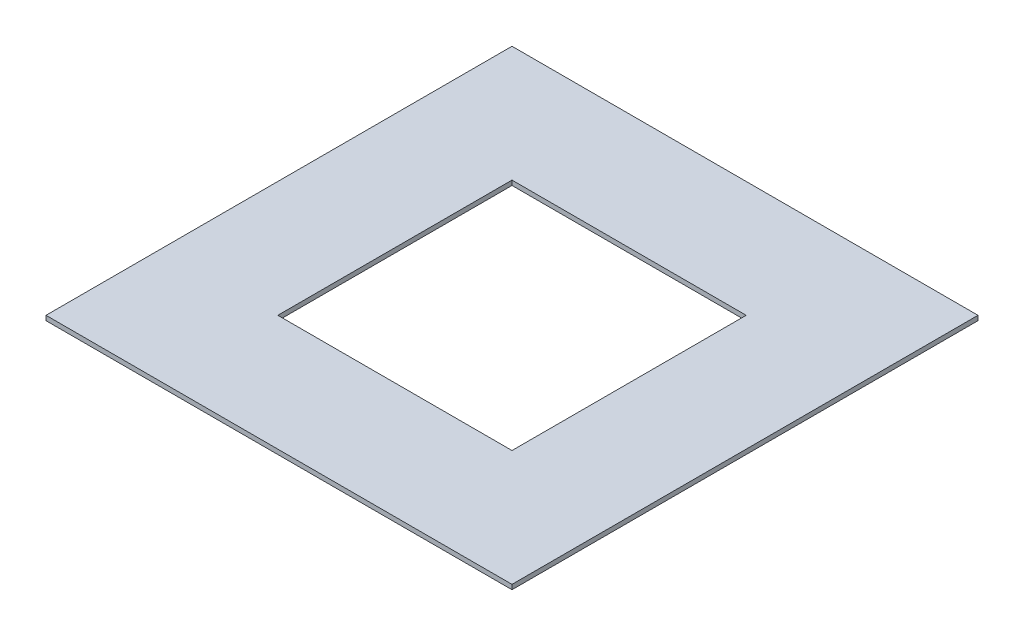
ISO-10303-21;
HEADER;
FILE_DESCRIPTION(('STEP AP214'),'2;1');
FILE_NAME('part.step','',(''),(''),'','','');
FILE_SCHEMA(('AUTOMOTIVE_DESIGN { 1 0 10303 214 1 1 1 1 }'));
ENDSEC;
DATA;
#1=APPLICATION_CONTEXT('core data for automotive mechanical design processes');
#2=APPLICATION_PROTOCOL_DEFINITION('international standard','automotive_design',2000,#1);
#3=PRODUCT_CONTEXT('',#1,'mechanical');
#4=PRODUCT('Part','Part','',(#3));
#5=PRODUCT_RELATED_PRODUCT_CATEGORY('part','',(#4));
#6=PRODUCT_DEFINITION_FORMATION('','',#4);
#7=PRODUCT_DEFINITION_CONTEXT('part definition',#1,'design');
#8=PRODUCT_DEFINITION('design','',#6,#7);
#9=PRODUCT_DEFINITION_SHAPE('','',#8);
#10=(LENGTH_UNIT() NAMED_UNIT(*) SI_UNIT(.MILLI.,.METRE.));
#11=(NAMED_UNIT(*) PLANE_ANGLE_UNIT() SI_UNIT($,.RADIAN.));
#12=(NAMED_UNIT(*) SI_UNIT($,.STERADIAN.) SOLID_ANGLE_UNIT());
#13=UNCERTAINTY_MEASURE_WITH_UNIT(LENGTH_MEASURE(1.E-05),#10,'distance_accuracy_value','');
#14=(GEOMETRIC_REPRESENTATION_CONTEXT(3) GLOBAL_UNCERTAINTY_ASSIGNED_CONTEXT((#13)) GLOBAL_UNIT_ASSIGNED_CONTEXT((#10,
#11,#12)) REPRESENTATION_CONTEXT('',''));
#15=CARTESIAN_POINT('',(0.,0.,0.));
#16=DIRECTION('',(0.,0.,1.));
#17=DIRECTION('',(1.,0.,0.));
#18=AXIS2_PLACEMENT_3D('',#15,#16,#17);
#19=CARTESIAN_POINT('',(0.,1.,0.));
#20=DIRECTION('',(0.,1.,0.));
#21=DIRECTION('',(0.,0.,1.));
#22=AXIS2_PLACEMENT_3D('',#19,#20,#21);
#23=PLANE('',#22);
#24=DIRECTION('',(0.,0.,-1.));
#25=VECTOR('',#24,1.);
#26=CARTESIAN_POINT('',(49.75,1.,-49.75));
#27=LINE('',#26,#25);
#28=CARTESIAN_POINT('',(49.75,1.,49.75));
#29=VERTEX_POINT('',#28);
#30=CARTESIAN_POINT('',(49.75,1.,-49.75));
#31=VERTEX_POINT('',#30);
#32=EDGE_CURVE('E134',#29,#31,#27,.T.);
#33=ORIENTED_EDGE('',*,*,#32,.T.);
#34=DIRECTION('',(-1.,0.,0.));
#35=VECTOR('',#34,1.);
#36=CARTESIAN_POINT('',(-49.75,1.,-49.75));
#37=LINE('',#36,#35);
#38=CARTESIAN_POINT('',(-49.75,1.,-49.75));
#39=VERTEX_POINT('',#38);
#40=EDGE_CURVE('E137',#31,#39,#37,.T.);
#41=ORIENTED_EDGE('',*,*,#40,.T.);
#42=DIRECTION('',(0.,0.,1.));
#43=VECTOR('',#42,1.);
#44=CARTESIAN_POINT('',(-49.75,1.,-49.75));
#45=LINE('',#44,#43);
#46=CARTESIAN_POINT('',(-49.75,1.,49.75));
#47=VERTEX_POINT('',#46);
#48=EDGE_CURVE('E140',#39,#47,#45,.T.);
#49=ORIENTED_EDGE('',*,*,#48,.T.);
#50=DIRECTION('',(1.,0.,0.));
#51=VECTOR('',#50,1.);
#52=CARTESIAN_POINT('',(-49.75,1.,49.75));
#53=LINE('',#52,#51);
#54=EDGE_CURVE('E142',#47,#29,#53,.T.);
#55=ORIENTED_EDGE('',*,*,#54,.T.);
#56=EDGE_LOOP('',(#33,#41,#49,#55));
#57=FACE_BOUND('',#56,.T.);
#58=DIRECTION('',(-1.,0.,0.));
#59=VECTOR('',#58,1.);
#60=CARTESIAN_POINT('',(-25.,1.,-25.));
#61=LINE('',#60,#59);
#62=CARTESIAN_POINT('',(25.,1.,-25.));
#63=VERTEX_POINT('',#62);
#64=CARTESIAN_POINT('',(-25.,1.,-25.));
#65=VERTEX_POINT('',#64);
#66=EDGE_CURVE('E106',#63,#65,#61,.T.);
#67=ORIENTED_EDGE('',*,*,#66,.F.);
#68=DIRECTION('',(0.,0.,-1.));
#69=VECTOR('',#68,1.);
#70=CARTESIAN_POINT('',(25.,1.,-25.));
#71=LINE('',#70,#69);
#72=CARTESIAN_POINT('',(25.,1.,25.));
#73=VERTEX_POINT('',#72);
#74=EDGE_CURVE('E98',#73,#63,#71,.T.);
#75=ORIENTED_EDGE('',*,*,#74,.F.);
#76=DIRECTION('',(1.,0.,0.));
#77=VECTOR('',#76,1.);
#78=CARTESIAN_POINT('',(-25.,1.,25.));
#79=LINE('',#78,#77);
#80=CARTESIAN_POINT('',(-25.,1.,25.));
#81=VERTEX_POINT('',#80);
#82=EDGE_CURVE('E120',#81,#73,#79,.T.);
#83=ORIENTED_EDGE('',*,*,#82,.F.);
#84=DIRECTION('',(0.,0.,1.));
#85=VECTOR('',#84,1.);
#86=CARTESIAN_POINT('',(-25.,1.,-25.));
#87=LINE('',#86,#85);
#88=EDGE_CURVE('E118',#65,#81,#87,.T.);
#89=ORIENTED_EDGE('',*,*,#88,.F.);
#90=EDGE_LOOP('',(#67,#75,#83,#89));
#91=FACE_BOUND('',#90,.T.);
#92=ADVANCED_FACE('F33',(#57,#91),#23,.T.);
#93=CARTESIAN_POINT('',(0.,0.,0.));
#94=DIRECTION('',(0.,1.,0.));
#95=DIRECTION('',(0.,0.,1.));
#96=AXIS2_PLACEMENT_3D('',#93,#94,#95);
#97=PLANE('',#96);
#98=DIRECTION('',(0.,0.,-1.));
#99=VECTOR('',#98,1.);
#100=CARTESIAN_POINT('',(49.75,0.,-49.75));
#101=LINE('',#100,#99);
#102=CARTESIAN_POINT('',(49.75,0.,49.75));
#103=VERTEX_POINT('',#102);
#104=CARTESIAN_POINT('',(49.75,0.,-49.75));
#105=VERTEX_POINT('',#104);
#106=EDGE_CURVE('E114',#103,#105,#101,.T.);
#107=ORIENTED_EDGE('',*,*,#106,.F.);
#108=DIRECTION('',(1.,0.,0.));
#109=VECTOR('',#108,1.);
#110=CARTESIAN_POINT('',(-49.75,0.,49.75));
#111=LINE('',#110,#109);
#112=CARTESIAN_POINT('',(-49.75,0.,49.75));
#113=VERTEX_POINT('',#112);
#114=EDGE_CURVE('E138',#113,#103,#111,.T.);
#115=ORIENTED_EDGE('',*,*,#114,.F.);
#116=DIRECTION('',(0.,0.,1.));
#117=VECTOR('',#116,1.);
#118=CARTESIAN_POINT('',(-49.75,0.,-49.75));
#119=LINE('',#118,#117);
#120=CARTESIAN_POINT('',(-49.75,0.,-49.75));
#121=VERTEX_POINT('',#120);
#122=EDGE_CURVE('E149',#121,#113,#119,.T.);
#123=ORIENTED_EDGE('',*,*,#122,.F.);
#124=DIRECTION('',(-1.,0.,0.));
#125=VECTOR('',#124,1.);
#126=CARTESIAN_POINT('',(-49.75,0.,-49.75));
#127=LINE('',#126,#125);
#128=EDGE_CURVE('E147',#105,#121,#127,.T.);
#129=ORIENTED_EDGE('',*,*,#128,.F.);
#130=EDGE_LOOP('',(#107,#115,#123,#129));
#131=FACE_BOUND('',#130,.T.);
#132=DIRECTION('',(0.,0.,-1.));
#133=VECTOR('',#132,1.);
#134=CARTESIAN_POINT('',(25.,0.,-25.));
#135=LINE('',#134,#133);
#136=CARTESIAN_POINT('',(25.,0.,25.));
#137=VERTEX_POINT('',#136);
#138=CARTESIAN_POINT('',(25.,0.,-25.));
#139=VERTEX_POINT('',#138);
#140=EDGE_CURVE('E56',#137,#139,#135,.T.);
#141=ORIENTED_EDGE('',*,*,#140,.T.);
#142=DIRECTION('',(-1.,0.,0.));
#143=VECTOR('',#142,1.);
#144=CARTESIAN_POINT('',(-25.,0.,-25.));
#145=LINE('',#144,#143);
#146=CARTESIAN_POINT('',(-25.,0.,-25.));
#147=VERTEX_POINT('',#146);
#148=EDGE_CURVE('E113',#139,#147,#145,.T.);
#149=ORIENTED_EDGE('',*,*,#148,.T.);
#150=DIRECTION('',(0.,0.,1.));
#151=VECTOR('',#150,1.);
#152=CARTESIAN_POINT('',(-25.,0.,-25.));
#153=LINE('',#152,#151);
#154=CARTESIAN_POINT('',(-25.,0.,25.));
#155=VERTEX_POINT('',#154);
#156=EDGE_CURVE('E126',#147,#155,#153,.T.);
#157=ORIENTED_EDGE('',*,*,#156,.T.);
#158=DIRECTION('',(1.,0.,0.));
#159=VECTOR('',#158,1.);
#160=CARTESIAN_POINT('',(-25.,0.,25.));
#161=LINE('',#160,#159);
#162=EDGE_CURVE('E107',#155,#137,#161,.T.);
#163=ORIENTED_EDGE('',*,*,#162,.T.);
#164=EDGE_LOOP('',(#141,#149,#157,#163));
#165=FACE_BOUND('',#164,.T.);
#166=ADVANCED_FACE('F167',(#131,#165),#97,.F.);
#167=CARTESIAN_POINT('',(49.75,1.,-49.75));
#168=DIRECTION('',(-1.,0.,0.));
#169=DIRECTION('',(0.,0.,1.));
#170=AXIS2_PLACEMENT_3D('',#167,#168,#169);
#171=PLANE('',#170);
#172=ORIENTED_EDGE('',*,*,#106,.T.);
#173=DIRECTION('',(0.,-1.,0.));
#174=VECTOR('',#173,1.);
#175=CARTESIAN_POINT('',(49.75,1.,-49.75));
#176=LINE('',#175,#174);
#177=EDGE_CURVE('E11',#31,#105,#176,.T.);
#178=ORIENTED_EDGE('',*,*,#177,.F.);
#179=ORIENTED_EDGE('',*,*,#32,.F.);
#180=DIRECTION('',(0.,-1.,0.));
#181=VECTOR('',#180,1.);
#182=CARTESIAN_POINT('',(49.75,1.,49.75));
#183=LINE('',#182,#181);
#184=EDGE_CURVE('E144',#29,#103,#183,.T.);
#185=ORIENTED_EDGE('',*,*,#184,.T.);
#186=EDGE_LOOP('',(#172,#178,#179,#185));
#187=FACE_BOUND('',#186,.T.);
#188=ADVANCED_FACE('F35',(#187),#171,.F.);
#189=CARTESIAN_POINT('',(-49.75,1.,-49.75));
#190=DIRECTION('',(0.,0.,1.));
#191=DIRECTION('',(1.,0.,0.));
#192=AXIS2_PLACEMENT_3D('',#189,#190,#191);
#193=PLANE('',#192);
#194=ORIENTED_EDGE('',*,*,#128,.T.);
#195=DIRECTION('',(0.,-1.,0.));
#196=VECTOR('',#195,1.);
#197=CARTESIAN_POINT('',(-49.75,1.,-49.75));
#198=LINE('',#197,#196);
#199=EDGE_CURVE('E41',#39,#121,#198,.T.);
#200=ORIENTED_EDGE('',*,*,#199,.F.);
#201=ORIENTED_EDGE('',*,*,#40,.F.);
#202=ORIENTED_EDGE('',*,*,#177,.T.);
#203=EDGE_LOOP('',(#194,#200,#201,#202));
#204=FACE_BOUND('',#203,.T.);
#205=ADVANCED_FACE('F177',(#204),#193,.F.);
#206=CARTESIAN_POINT('',(-49.75,1.,-49.75));
#207=DIRECTION('',(1.,0.,0.));
#208=DIRECTION('',(0.,0.,-1.));
#209=AXIS2_PLACEMENT_3D('',#206,#207,#208);
#210=PLANE('',#209);
#211=ORIENTED_EDGE('',*,*,#122,.T.);
#212=DIRECTION('',(0.,-1.,0.));
#213=VECTOR('',#212,1.);
#214=CARTESIAN_POINT('',(-49.75,1.,49.75));
#215=LINE('',#214,#213);
#216=EDGE_CURVE('E154',#47,#113,#215,.T.);
#217=ORIENTED_EDGE('',*,*,#216,.F.);
#218=ORIENTED_EDGE('',*,*,#48,.F.);
#219=ORIENTED_EDGE('',*,*,#199,.T.);
#220=EDGE_LOOP('',(#211,#217,#218,#219));
#221=FACE_BOUND('',#220,.T.);
#222=ADVANCED_FACE('F161',(#221),#210,.F.);
#223=CARTESIAN_POINT('',(-49.75,1.,49.75));
#224=DIRECTION('',(0.,0.,-1.));
#225=DIRECTION('',(-1.,0.,0.));
#226=AXIS2_PLACEMENT_3D('',#223,#224,#225);
#227=PLANE('',#226);
#228=ORIENTED_EDGE('',*,*,#114,.T.);
#229=ORIENTED_EDGE('',*,*,#184,.F.);
#230=ORIENTED_EDGE('',*,*,#54,.F.);
#231=ORIENTED_EDGE('',*,*,#216,.T.);
#232=EDGE_LOOP('',(#228,#229,#230,#231));
#233=FACE_BOUND('',#232,.T.);
#234=ADVANCED_FACE('F171',(#233),#227,.F.);
#235=CARTESIAN_POINT('',(25.,1.,-25.));
#236=DIRECTION('',(-1.,0.,0.));
#237=DIRECTION('',(0.,0.,1.));
#238=AXIS2_PLACEMENT_3D('',#235,#236,#237);
#239=PLANE('',#238);
#240=ORIENTED_EDGE('',*,*,#140,.F.);
#241=DIRECTION('',(0.,-1.,0.));
#242=VECTOR('',#241,1.);
#243=CARTESIAN_POINT('',(25.,1.,25.));
#244=LINE('',#243,#242);
#245=EDGE_CURVE('E102',#73,#137,#244,.T.);
#246=ORIENTED_EDGE('',*,*,#245,.F.);
#247=ORIENTED_EDGE('',*,*,#74,.T.);
#248=DIRECTION('',(0.,-1.,0.));
#249=VECTOR('',#248,1.);
#250=CARTESIAN_POINT('',(25.,1.,-25.));
#251=LINE('',#250,#249);
#252=EDGE_CURVE('E101',#63,#139,#251,.T.);
#253=ORIENTED_EDGE('',*,*,#252,.T.);
#254=EDGE_LOOP('',(#240,#246,#247,#253));
#255=FACE_BOUND('',#254,.T.);
#256=ADVANCED_FACE('F100',(#255),#239,.T.);
#257=CARTESIAN_POINT('',(-25.,1.,-25.));
#258=DIRECTION('',(0.,0.,1.));
#259=DIRECTION('',(1.,0.,0.));
#260=AXIS2_PLACEMENT_3D('',#257,#258,#259);
#261=PLANE('',#260);
#262=ORIENTED_EDGE('',*,*,#148,.F.);
#263=ORIENTED_EDGE('',*,*,#252,.F.);
#264=ORIENTED_EDGE('',*,*,#66,.T.);
#265=DIRECTION('',(0.,-1.,0.));
#266=VECTOR('',#265,1.);
#267=CARTESIAN_POINT('',(-25.,1.,-25.));
#268=LINE('',#267,#266);
#269=EDGE_CURVE('E115',#65,#147,#268,.T.);
#270=ORIENTED_EDGE('',*,*,#269,.T.);
#271=EDGE_LOOP('',(#262,#263,#264,#270));
#272=FACE_BOUND('',#271,.T.);
#273=ADVANCED_FACE('F110',(#272),#261,.T.);
#274=CARTESIAN_POINT('',(-25.,1.,-25.));
#275=DIRECTION('',(1.,0.,0.));
#276=DIRECTION('',(0.,0.,-1.));
#277=AXIS2_PLACEMENT_3D('',#274,#275,#276);
#278=PLANE('',#277);
#279=ORIENTED_EDGE('',*,*,#156,.F.);
#280=ORIENTED_EDGE('',*,*,#269,.F.);
#281=ORIENTED_EDGE('',*,*,#88,.T.);
#282=DIRECTION('',(0.,-1.,0.));
#283=VECTOR('',#282,1.);
#284=CARTESIAN_POINT('',(-25.,1.,25.));
#285=LINE('',#284,#283);
#286=EDGE_CURVE('E48',#81,#155,#285,.T.);
#287=ORIENTED_EDGE('',*,*,#286,.T.);
#288=EDGE_LOOP('',(#279,#280,#281,#287));
#289=FACE_BOUND('',#288,.T.);
#290=ADVANCED_FACE('F200',(#289),#278,.T.);
#291=CARTESIAN_POINT('',(-25.,1.,25.));
#292=DIRECTION('',(0.,0.,-1.));
#293=DIRECTION('',(-1.,0.,0.));
#294=AXIS2_PLACEMENT_3D('',#291,#292,#293);
#295=PLANE('',#294);
#296=ORIENTED_EDGE('',*,*,#162,.F.);
#297=ORIENTED_EDGE('',*,*,#286,.F.);
#298=ORIENTED_EDGE('',*,*,#82,.T.);
#299=ORIENTED_EDGE('',*,*,#245,.T.);
#300=EDGE_LOOP('',(#296,#297,#298,#299));
#301=FACE_BOUND('',#300,.T.);
#302=ADVANCED_FACE('F204',(#301),#295,.T.);
#303=CLOSED_SHELL('',(#92,#166,#188,#205,#222,#234,#256,#273,#290,#302));
#304=MANIFOLD_SOLID_BREP('B2',#303);
#305=ADVANCED_BREP_SHAPE_REPRESENTATION('',(#18,#304),#14);
#306=SHAPE_DEFINITION_REPRESENTATION(#9,#305);
ENDSEC;
END-ISO-10303-21;
